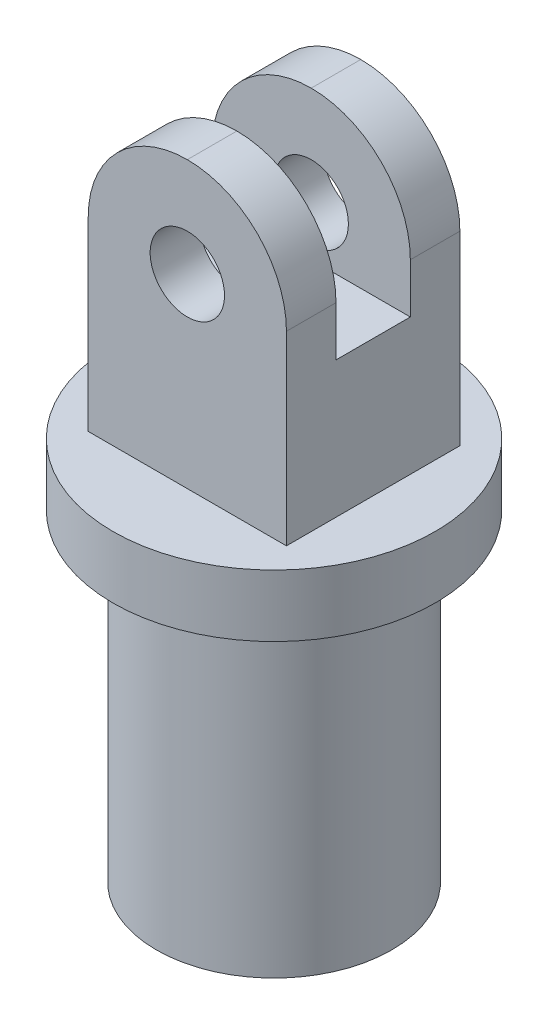
ISO-10303-21;
HEADER;
FILE_DESCRIPTION(('STEP AP214'),'2;1');
FILE_NAME('part.step','',(''),(''),'','','');
FILE_SCHEMA(('AUTOMOTIVE_DESIGN { 1 0 10303 214 1 1 1 1 }'));
ENDSEC;
DATA;
#1=APPLICATION_CONTEXT('core data for automotive mechanical design processes');
#2=APPLICATION_PROTOCOL_DEFINITION('international standard','automotive_design',2000,#1);
#3=PRODUCT_CONTEXT('',#1,'mechanical');
#4=PRODUCT('Part','Part','',(#3));
#5=PRODUCT_RELATED_PRODUCT_CATEGORY('part','',(#4));
#6=PRODUCT_DEFINITION_FORMATION('','',#4);
#7=PRODUCT_DEFINITION_CONTEXT('part definition',#1,'design');
#8=PRODUCT_DEFINITION('design','',#6,#7);
#9=PRODUCT_DEFINITION_SHAPE('','',#8);
#10=(LENGTH_UNIT() NAMED_UNIT(*) SI_UNIT(.MILLI.,.METRE.));
#11=(NAMED_UNIT(*) PLANE_ANGLE_UNIT() SI_UNIT($,.RADIAN.));
#12=(NAMED_UNIT(*) SI_UNIT($,.STERADIAN.) SOLID_ANGLE_UNIT());
#13=UNCERTAINTY_MEASURE_WITH_UNIT(LENGTH_MEASURE(1.E-05),#10,'distance_accuracy_value','');
#14=(GEOMETRIC_REPRESENTATION_CONTEXT(3) GLOBAL_UNCERTAINTY_ASSIGNED_CONTEXT((#13)) GLOBAL_UNIT_ASSIGNED_CONTEXT((#10,
#11,#12)) REPRESENTATION_CONTEXT('',''));
#15=CARTESIAN_POINT('',(0.,0.,0.));
#16=DIRECTION('',(0.,0.,1.));
#17=DIRECTION('',(1.,0.,0.));
#18=AXIS2_PLACEMENT_3D('',#15,#16,#17);
#19=CARTESIAN_POINT('',(0.,10.,3.5));
#20=DIRECTION('',(0.,0.,-1.));
#21=DIRECTION('',(-1.,0.,0.));
#22=AXIS2_PLACEMENT_3D('',#19,#20,#21);
#23=CYLINDRICAL_SURFACE('',#22,4.);
#24=CARTESIAN_POINT('',(0.,10.,1.5));
#25=DIRECTION('',(0.,0.,1.));
#26=DIRECTION('',(0.,-1.,0.));
#27=AXIS2_PLACEMENT_3D('',#24,#25,#26);
#28=CIRCLE('',#27,4.);
#29=CARTESIAN_POINT('',(-4.,10.,1.5));
#30=VERTEX_POINT('',#29);
#31=CARTESIAN_POINT('',(0.,14.,1.5));
#32=VERTEX_POINT('',#31);
#33=EDGE_CURVE('E142',#30,#32,#28,.F.);
#34=ORIENTED_EDGE('',*,*,#33,.F.);
#35=DIRECTION('',(0.,0.,1.));
#36=VECTOR('',#35,1.);
#37=CARTESIAN_POINT('',(-4.,10.,-3.5));
#38=LINE('',#37,#36);
#39=CARTESIAN_POINT('',(-4.,10.,3.5));
#40=VERTEX_POINT('',#39);
#41=EDGE_CURVE('E40',#40,#30,#38,.F.);
#42=ORIENTED_EDGE('',*,*,#41,.F.);
#43=CARTESIAN_POINT('',(0.,10.,3.5));
#44=DIRECTION('',(0.,0.,-1.));
#45=DIRECTION('',(-1.,0.,0.));
#46=AXIS2_PLACEMENT_3D('',#43,#44,#45);
#47=CIRCLE('',#46,4.);
#48=CARTESIAN_POINT('',(0.,14.,3.5));
#49=VERTEX_POINT('',#48);
#50=EDGE_CURVE('E55',#49,#40,#47,.F.);
#51=ORIENTED_EDGE('',*,*,#50,.F.);
#52=DIRECTION('',(0.,0.,1.));
#53=VECTOR('',#52,1.);
#54=CARTESIAN_POINT('',(0.,14.,3.5));
#55=LINE('',#54,#53);
#56=EDGE_CURVE('E205',#32,#49,#55,.T.);
#57=ORIENTED_EDGE('',*,*,#56,.F.);
#58=EDGE_LOOP('',(#34,#42,#51,#57));
#59=FACE_BOUND('',#58,.T.);
#60=ADVANCED_FACE('F32',(#59),#23,.T.);
#61=CARTESIAN_POINT('',(0.,10.,3.5));
#62=DIRECTION('',(0.,0.,1.));
#63=DIRECTION('',(1.,0.,0.));
#64=AXIS2_PLACEMENT_3D('',#61,#62,#63);
#65=CYLINDRICAL_SURFACE('',#64,4.);
#66=CARTESIAN_POINT('',(0.,10.,1.5));
#67=DIRECTION('',(0.,0.,1.));
#68=DIRECTION('',(0.,-1.,0.));
#69=AXIS2_PLACEMENT_3D('',#66,#67,#68);
#70=CIRCLE('',#69,4.);
#71=CARTESIAN_POINT('',(4.,10.,1.5));
#72=VERTEX_POINT('',#71);
#73=EDGE_CURVE('E140',#32,#72,#70,.F.);
#74=ORIENTED_EDGE('',*,*,#73,.F.);
#75=ORIENTED_EDGE('',*,*,#56,.T.);
#76=CARTESIAN_POINT('',(0.,10.,3.5));
#77=DIRECTION('',(0.,0.,-1.));
#78=DIRECTION('',(-1.,0.,0.));
#79=AXIS2_PLACEMENT_3D('',#76,#77,#78);
#80=CIRCLE('',#79,4.);
#81=CARTESIAN_POINT('',(4.,10.,3.5));
#82=VERTEX_POINT('',#81);
#83=EDGE_CURVE('E199',#82,#49,#80,.F.);
#84=ORIENTED_EDGE('',*,*,#83,.F.);
#85=DIRECTION('',(0.,0.,-1.));
#86=VECTOR('',#85,1.);
#87=CARTESIAN_POINT('',(4.,10.,3.5));
#88=LINE('',#87,#86);
#89=EDGE_CURVE('E194',#72,#82,#88,.F.);
#90=ORIENTED_EDGE('',*,*,#89,.F.);
#91=EDGE_LOOP('',(#74,#75,#84,#90));
#92=FACE_BOUND('',#91,.T.);
#93=ADVANCED_FACE('F245',(#92),#65,.T.);
#94=CARTESIAN_POINT('',(0.,10.,-9.5));
#95=DIRECTION('',(0.,0.,1.));
#96=DIRECTION('',(1.,0.,0.));
#97=AXIS2_PLACEMENT_3D('',#94,#95,#96);
#98=CYLINDRICAL_SURFACE('',#97,1.5);
#99=CARTESIAN_POINT('',(0.,10.,1.5));
#100=DIRECTION('',(0.,0.,1.));
#101=DIRECTION('',(0.,-1.,0.));
#102=AXIS2_PLACEMENT_3D('',#99,#100,#101);
#103=CIRCLE('',#102,1.5);
#104=CARTESIAN_POINT('',(1.5,10.,1.5));
#105=VERTEX_POINT('',#104);
#106=EDGE_CURVE('E139',#105,#105,#103,.F.);
#107=CARTESIAN_POINT('',(0.,10.,3.5));
#108=DIRECTION('',(0.,0.,1.));
#109=DIRECTION('',(1.,0.,0.));
#110=AXIS2_PLACEMENT_3D('',#107,#108,#109);
#111=CIRCLE('',#110,1.5);
#112=CARTESIAN_POINT('',(1.5,10.,3.5));
#113=VERTEX_POINT('',#112);
#114=EDGE_CURVE('E147',#113,#113,#111,.T.);
#115=CARTESIAN_POINT('',(1.5,10.,1.5));
#116=CARTESIAN_POINT('',(1.5,10.,1.52083333333333));
#117=CARTESIAN_POINT('',(1.5,10.,1.54166666666666));
#118=CARTESIAN_POINT('',(1.5,10.,1.58333333333333));
#119=CARTESIAN_POINT('',(1.5,10.,1.60416666666666));
#120=CARTESIAN_POINT('',(1.5,10.,1.64583333333333));
#121=CARTESIAN_POINT('',(1.5,10.,1.66666666666666));
#122=CARTESIAN_POINT('',(1.5,10.,1.70833333333333));
#123=CARTESIAN_POINT('',(1.5,10.,1.72916666666666));
#124=CARTESIAN_POINT('',(1.5,10.,1.77083333333333));
#125=CARTESIAN_POINT('',(1.5,10.,1.79166666666666));
#126=CARTESIAN_POINT('',(1.5,10.,1.83333333333333));
#127=CARTESIAN_POINT('',(1.5,10.,1.85416666666666));
#128=CARTESIAN_POINT('',(1.5,10.,1.89583333333333));
#129=CARTESIAN_POINT('',(1.5,10.,1.91666666666666));
#130=CARTESIAN_POINT('',(1.5,10.,1.95833333333333));
#131=CARTESIAN_POINT('',(1.5,10.,1.97916666666667));
#132=CARTESIAN_POINT('',(1.5,10.,2.02083333333333));
#133=CARTESIAN_POINT('',(1.5,10.,2.04166666666667));
#134=CARTESIAN_POINT('',(1.5,10.,2.08333333333333));
#135=CARTESIAN_POINT('',(1.5,10.,2.10416666666667));
#136=CARTESIAN_POINT('',(1.5,10.,2.14583333333333));
#137=CARTESIAN_POINT('',(1.5,10.,2.16666666666667));
#138=CARTESIAN_POINT('',(1.5,10.,2.20833333333333));
#139=CARTESIAN_POINT('',(1.5,10.,2.22916666666667));
#140=CARTESIAN_POINT('',(1.5,10.,2.27083333333333));
#141=CARTESIAN_POINT('',(1.5,10.,2.29166666666667));
#142=CARTESIAN_POINT('',(1.5,10.,2.33333333333333));
#143=CARTESIAN_POINT('',(1.5,10.,2.35416666666667));
#144=CARTESIAN_POINT('',(1.5,10.,2.39583333333333));
#145=CARTESIAN_POINT('',(1.5,10.,2.41666666666667));
#146=CARTESIAN_POINT('',(1.5,10.,2.45833333333333));
#147=CARTESIAN_POINT('',(1.5,10.,2.47916666666667));
#148=CARTESIAN_POINT('',(1.5,10.,2.52083333333333));
#149=CARTESIAN_POINT('',(1.5,10.,2.54166666666667));
#150=CARTESIAN_POINT('',(1.5,10.,2.58333333333333));
#151=CARTESIAN_POINT('',(1.5,10.,2.60416666666667));
#152=CARTESIAN_POINT('',(1.5,10.,2.64583333333333));
#153=CARTESIAN_POINT('',(1.5,10.,2.66666666666667));
#154=CARTESIAN_POINT('',(1.5,10.,2.70833333333333));
#155=CARTESIAN_POINT('',(1.5,10.,2.72916666666667));
#156=CARTESIAN_POINT('',(1.5,10.,2.77083333333333));
#157=CARTESIAN_POINT('',(1.5,10.,2.79166666666667));
#158=CARTESIAN_POINT('',(1.5,10.,2.83333333333333));
#159=CARTESIAN_POINT('',(1.5,10.,2.85416666666667));
#160=CARTESIAN_POINT('',(1.5,10.,2.89583333333333));
#161=CARTESIAN_POINT('',(1.5,10.,2.91666666666667));
#162=CARTESIAN_POINT('',(1.5,10.,2.95833333333333));
#163=CARTESIAN_POINT('',(1.5,10.,2.97916666666667));
#164=CARTESIAN_POINT('',(1.5,10.,3.02083333333333));
#165=CARTESIAN_POINT('',(1.5,10.,3.04166666666667));
#166=CARTESIAN_POINT('',(1.5,10.,3.08333333333333));
#167=CARTESIAN_POINT('',(1.5,10.,3.10416666666667));
#168=CARTESIAN_POINT('',(1.5,10.,3.14583333333333));
#169=CARTESIAN_POINT('',(1.5,10.,3.16666666666667));
#170=CARTESIAN_POINT('',(1.5,10.,3.20833333333333));
#171=CARTESIAN_POINT('',(1.5,10.,3.22916666666667));
#172=CARTESIAN_POINT('',(1.5,10.,3.27083333333333));
#173=CARTESIAN_POINT('',(1.5,10.,3.29166666666667));
#174=CARTESIAN_POINT('',(1.5,10.,3.33333333333333));
#175=CARTESIAN_POINT('',(1.5,10.,3.35416666666667));
#176=CARTESIAN_POINT('',(1.5,10.,3.39583333333333));
#177=CARTESIAN_POINT('',(1.5,10.,3.41666666666667));
#178=CARTESIAN_POINT('',(1.5,10.,3.45833333333333));
#179=CARTESIAN_POINT('',(1.5,10.,3.47916666666667));
#180=CARTESIAN_POINT('',(1.5,10.,3.5));
#181=B_SPLINE_CURVE_WITH_KNOTS('',3,(#115,#116,#117,#118,#119,#120,#121,#122,#123,#124,#125,
#126,#127,#128,#129,#130,#131,#132,#133,#134,#135,#136,#137,#138,#139,#140,#141,#142,#143,#144,
#145,#146,#147,#148,#149,#150,#151,#152,#153,#154,#155,#156,#157,#158,#159,#160,#161,#162,#163,
#164,#165,#166,#167,#168,#169,#170,#171,#172,#173,#174,#175,#176,#177,#178,#179,#180),
.UNSPECIFIED.,.F.,.F.,(4,2,2,2,2,2,2,2,2,2,2,2,2,2,2,2,2,2,2,2,2,2,2,2,2,2,2,2,2,2,2,2,4),(0.,
0.0625000000000001,0.125,0.1875,0.25,0.3125,0.375,0.4375,0.5,0.5625,0.625000000000001,
0.687500000000001,0.750000000000001,0.812500000000001,0.875000000000001,0.937500000000001,1.,
1.0625,1.125,1.1875,1.25,1.3125,1.375,1.4375,1.5,1.5625,1.625,1.6875,1.75,1.8125,1.875,1.9375,
2.),.UNSPECIFIED.);
#182=EDGE_CURVE('BSEAM212',#105,#113,#181,.T.);
#183=ORIENTED_EDGE('',*,*,#106,.T.);
#184=ORIENTED_EDGE('',*,*,#114,.T.);
#185=ORIENTED_EDGE('',*,*,#182,.T.);
#186=ORIENTED_EDGE('',*,*,#182,.F.);
#187=EDGE_LOOP('',(#183,#185,#184,#186));
#188=FACE_BOUND('',#187,.T.);
#189=ADVANCED_FACE('F212',(#188),#98,.F.);
#190=CARTESIAN_POINT('',(0.,2.5,0.));
#191=DIRECTION('',(0.,1.,0.));
#192=DIRECTION('',(0.,0.,1.));
#193=AXIS2_PLACEMENT_3D('',#190,#191,#192);
#194=PLANE('',#193);
#195=CARTESIAN_POINT('',(0.,2.5,0.));
#196=DIRECTION('',(0.,1.,0.));
#197=DIRECTION('',(0.,0.,1.));
#198=AXIS2_PLACEMENT_3D('',#195,#196,#197);
#199=CIRCLE('',#198,6.5);
#200=CARTESIAN_POINT('',(0.,2.5,6.5));
#201=VERTEX_POINT('',#200);
#202=EDGE_CURVE('E182',#201,#201,#199,.T.);
#203=ORIENTED_EDGE('',*,*,#202,.T.);
#204=EDGE_LOOP('',(#203));
#205=FACE_BOUND('',#204,.T.);
#206=DIRECTION('',(1.,0.,0.));
#207=VECTOR('',#206,1.);
#208=CARTESIAN_POINT('',(-4.,2.5,3.5));
#209=LINE('',#208,#207);
#210=CARTESIAN_POINT('',(-4.,2.5,3.5));
#211=VERTEX_POINT('',#210);
#212=CARTESIAN_POINT('',(4.,2.5,3.5));
#213=VERTEX_POINT('',#212);
#214=EDGE_CURVE('E154',#211,#213,#209,.T.);
#215=ORIENTED_EDGE('',*,*,#214,.F.);
#216=DIRECTION('',(0.,0.,1.));
#217=VECTOR('',#216,1.);
#218=CARTESIAN_POINT('',(-4.,2.5,-3.5));
#219=LINE('',#218,#217);
#220=CARTESIAN_POINT('',(-4.,2.5,-3.5));
#221=VERTEX_POINT('',#220);
#222=EDGE_CURVE('E151',#221,#211,#219,.T.);
#223=ORIENTED_EDGE('',*,*,#222,.F.);
#224=DIRECTION('',(-1.,0.,0.));
#225=VECTOR('',#224,1.);
#226=CARTESIAN_POINT('',(-4.,2.5,-3.5));
#227=LINE('',#226,#225);
#228=CARTESIAN_POINT('',(4.,2.5,-3.5));
#229=VERTEX_POINT('',#228);
#230=EDGE_CURVE('E161',#229,#221,#227,.T.);
#231=ORIENTED_EDGE('',*,*,#230,.F.);
#232=DIRECTION('',(0.,0.,-1.));
#233=VECTOR('',#232,1.);
#234=CARTESIAN_POINT('',(4.,2.5,-3.5));
#235=LINE('',#234,#233);
#236=EDGE_CURVE('E158',#213,#229,#235,.T.);
#237=ORIENTED_EDGE('',*,*,#236,.F.);
#238=EDGE_LOOP('',(#215,#223,#231,#237));
#239=FACE_BOUND('',#238,.T.);
#240=ADVANCED_FACE('F239',(#205,#239),#194,.T.);
#241=CARTESIAN_POINT('',(0.,0.,0.));
#242=DIRECTION('',(0.,1.,0.));
#243=DIRECTION('',(0.,0.,1.));
#244=AXIS2_PLACEMENT_3D('',#241,#242,#243);
#245=PLANE('',#244);
#246=CARTESIAN_POINT('',(0.,0.,0.));
#247=DIRECTION('',(0.,1.,0.));
#248=DIRECTION('',(0.,0.,1.));
#249=AXIS2_PLACEMENT_3D('',#246,#247,#248);
#250=CIRCLE('',#249,6.5);
#251=CARTESIAN_POINT('',(0.,0.,6.5));
#252=VERTEX_POINT('',#251);
#253=EDGE_CURVE('E181',#252,#252,#250,.T.);
#254=ORIENTED_EDGE('',*,*,#253,.F.);
#255=EDGE_LOOP('',(#254));
#256=FACE_BOUND('',#255,.T.);
#257=CARTESIAN_POINT('',(0.,0.,0.));
#258=DIRECTION('',(0.,1.,0.));
#259=DIRECTION('',(0.,0.,1.));
#260=AXIS2_PLACEMENT_3D('',#257,#258,#259);
#261=CIRCLE('',#260,4.75);
#262=CARTESIAN_POINT('',(0.,0.,4.75));
#263=VERTEX_POINT('',#262);
#264=EDGE_CURVE('E185',#263,#263,#261,.F.);
#265=ORIENTED_EDGE('',*,*,#264,.F.);
#266=EDGE_LOOP('',(#265));
#267=FACE_BOUND('',#266,.T.);
#268=ADVANCED_FACE('F354',(#256,#267),#245,.F.);
#269=CARTESIAN_POINT('',(0.,2.5,0.));
#270=DIRECTION('',(0.,-1.,0.));
#271=DIRECTION('',(0.,0.,-1.));
#272=AXIS2_PLACEMENT_3D('',#269,#270,#271);
#273=CYLINDRICAL_SURFACE('',#272,6.5);
#274=ORIENTED_EDGE('',*,*,#202,.F.);
#275=EDGE_LOOP('',(#274));
#276=FACE_BOUND('',#275,.T.);
#277=ORIENTED_EDGE('',*,*,#253,.T.);
#278=EDGE_LOOP('',(#277));
#279=FACE_BOUND('',#278,.T.);
#280=ADVANCED_FACE('F383',(#276,#279),#273,.T.);
#281=CARTESIAN_POINT('',(0.,-13.,0.));
#282=DIRECTION('',(0.,-1.,0.));
#283=DIRECTION('',(0.,0.,-1.));
#284=AXIS2_PLACEMENT_3D('',#281,#282,#283);
#285=PLANE('',#284);
#286=CARTESIAN_POINT('',(0.,-13.,0.));
#287=DIRECTION('',(0.,-1.,0.));
#288=DIRECTION('',(0.,0.,-1.));
#289=AXIS2_PLACEMENT_3D('',#286,#287,#288);
#290=CIRCLE('',#289,4.75);
#291=CARTESIAN_POINT('',(0.,-13.,4.75));
#292=VERTEX_POINT('',#291);
#293=EDGE_CURVE('E176',#292,#292,#290,.T.);
#294=ORIENTED_EDGE('',*,*,#293,.T.);
#295=EDGE_LOOP('',(#294));
#296=FACE_BOUND('',#295,.T.);
#297=CARTESIAN_POINT('',(0.,-13.,0.));
#298=DIRECTION('',(0.,-1.,0.));
#299=DIRECTION('',(0.,0.,-1.));
#300=AXIS2_PLACEMENT_3D('',#297,#298,#299);
#301=CIRCLE('',#300,3.);
#302=CARTESIAN_POINT('',(0.,-13.,3.));
#303=VERTEX_POINT('',#302);
#304=EDGE_CURVE('E173',#303,#303,#301,.T.);
#305=ORIENTED_EDGE('',*,*,#304,.F.);
#306=EDGE_LOOP('',(#305));
#307=FACE_BOUND('',#306,.T.);
#308=ADVANCED_FACE('F374',(#296,#307),#285,.T.);
#309=CARTESIAN_POINT('',(0.,-13.,0.));
#310=DIRECTION('',(0.,1.,0.));
#311=DIRECTION('',(0.,0.,1.));
#312=AXIS2_PLACEMENT_3D('',#309,#310,#311);
#313=CYLINDRICAL_SURFACE('',#312,4.75);
#314=CARTESIAN_POINT('',(0.,-13.,4.75));
#315=CARTESIAN_POINT('',(0.,-12.8645833333333,4.75));
#316=CARTESIAN_POINT('',(0.,-12.7291666666667,4.75));
#317=CARTESIAN_POINT('',(0.,-12.4583333333333,4.75));
#318=CARTESIAN_POINT('',(0.,-12.3229166666667,4.75));
#319=CARTESIAN_POINT('',(0.,-12.0520833333333,4.75));
#320=CARTESIAN_POINT('',(0.,-11.9166666666667,4.75));
#321=CARTESIAN_POINT('',(0.,-11.6458333333333,4.75));
#322=CARTESIAN_POINT('',(0.,-11.5104166666667,4.75));
#323=CARTESIAN_POINT('',(0.,-11.2395833333333,4.75));
#324=CARTESIAN_POINT('',(0.,-11.1041666666667,4.75));
#325=CARTESIAN_POINT('',(0.,-10.8333333333333,4.75));
#326=CARTESIAN_POINT('',(0.,-10.6979166666667,4.75));
#327=CARTESIAN_POINT('',(0.,-10.4270833333333,4.75));
#328=CARTESIAN_POINT('',(0.,-10.2916666666667,4.75));
#329=CARTESIAN_POINT('',(0.,-10.0208333333333,4.75));
#330=CARTESIAN_POINT('',(0.,-9.88541666666667,4.75));
#331=CARTESIAN_POINT('',(0.,-9.61458333333333,4.75));
#332=CARTESIAN_POINT('',(0.,-9.47916666666667,4.75));
#333=CARTESIAN_POINT('',(0.,-9.20833333333333,4.75));
#334=CARTESIAN_POINT('',(0.,-9.07291666666666,4.75));
#335=CARTESIAN_POINT('',(0.,-8.80208333333333,4.75));
#336=CARTESIAN_POINT('',(0.,-8.66666666666667,4.75));
#337=CARTESIAN_POINT('',(0.,-8.39583333333333,4.75));
#338=CARTESIAN_POINT('',(0.,-8.26041666666667,4.75));
#339=CARTESIAN_POINT('',(0.,-7.98958333333333,4.75));
#340=CARTESIAN_POINT('',(0.,-7.85416666666667,4.75));
#341=CARTESIAN_POINT('',(0.,-7.58333333333333,4.75));
#342=CARTESIAN_POINT('',(0.,-7.44791666666667,4.75));
#343=CARTESIAN_POINT('',(0.,-7.17708333333333,4.75));
#344=CARTESIAN_POINT('',(0.,-7.04166666666667,4.75));
#345=CARTESIAN_POINT('',(0.,-6.77083333333333,4.75));
#346=CARTESIAN_POINT('',(0.,-6.63541666666667,4.75));
#347=CARTESIAN_POINT('',(0.,-6.36458333333333,4.75));
#348=CARTESIAN_POINT('',(0.,-6.22916666666667,4.75));
#349=CARTESIAN_POINT('',(0.,-5.95833333333333,4.75));
#350=CARTESIAN_POINT('',(0.,-5.82291666666667,4.75));
#351=CARTESIAN_POINT('',(0.,-5.55208333333333,4.75));
#352=CARTESIAN_POINT('',(0.,-5.41666666666667,4.75));
#353=CARTESIAN_POINT('',(0.,-5.14583333333333,4.75));
#354=CARTESIAN_POINT('',(0.,-5.01041666666667,4.75));
#355=CARTESIAN_POINT('',(0.,-4.73958333333333,4.75));
#356=CARTESIAN_POINT('',(0.,-4.60416666666667,4.75));
#357=CARTESIAN_POINT('',(0.,-4.33333333333333,4.75));
#358=CARTESIAN_POINT('',(0.,-4.19791666666667,4.75));
#359=CARTESIAN_POINT('',(0.,-3.92708333333333,4.75));
#360=CARTESIAN_POINT('',(0.,-3.79166666666667,4.75));
#361=CARTESIAN_POINT('',(0.,-3.52083333333333,4.75));
#362=CARTESIAN_POINT('',(0.,-3.38541666666667,4.75));
#363=CARTESIAN_POINT('',(0.,-3.11458333333333,4.75));
#364=CARTESIAN_POINT('',(0.,-2.97916666666667,4.75));
#365=CARTESIAN_POINT('',(0.,-2.70833333333333,4.75));
#366=CARTESIAN_POINT('',(0.,-2.57291666666667,4.75));
#367=CARTESIAN_POINT('',(0.,-2.30208333333333,4.75));
#368=CARTESIAN_POINT('',(0.,-2.16666666666667,4.75));
#369=CARTESIAN_POINT('',(0.,-1.89583333333333,4.75));
#370=CARTESIAN_POINT('',(0.,-1.76041666666667,4.75));
#371=CARTESIAN_POINT('',(0.,-1.48958333333333,4.75));
#372=CARTESIAN_POINT('',(0.,-1.35416666666667,4.75));
#373=CARTESIAN_POINT('',(0.,-1.08333333333333,4.75));
#374=CARTESIAN_POINT('',(0.,-0.947916666666667,4.75));
#375=CARTESIAN_POINT('',(0.,-0.677083333333334,4.75));
#376=CARTESIAN_POINT('',(0.,-0.541666666666667,4.75));
#377=CARTESIAN_POINT('',(0.,-0.270833333333334,4.75));
#378=CARTESIAN_POINT('',(0.,-0.135416666666667,4.75));
#379=CARTESIAN_POINT('',(0.,0.,4.75));
#380=B_SPLINE_CURVE_WITH_KNOTS('',3,(#314,#315,#316,#317,#318,#319,#320,#321,#322,#323,#324,
#325,#326,#327,#328,#329,#330,#331,#332,#333,#334,#335,#336,#337,#338,#339,#340,#341,#342,#343,
#344,#345,#346,#347,#348,#349,#350,#351,#352,#353,#354,#355,#356,#357,#358,#359,#360,#361,#362,
#363,#364,#365,#366,#367,#368,#369,#370,#371,#372,#373,#374,#375,#376,#377,#378,#379),
.UNSPECIFIED.,.F.,.F.,(4,2,2,2,2,2,2,2,2,2,2,2,2,2,2,2,2,2,2,2,2,2,2,2,2,2,2,2,2,2,2,2,4),(0.,
0.40625,0.812500000000001,1.21875,1.625,2.03125,2.4375,2.84375,3.25,3.65625,4.0625,4.46875,
4.875,5.28125,5.6875,6.09375,6.5,6.90625,7.3125,7.71875,8.125,8.53125,8.9375,9.34375,9.75,
10.15625,10.5625,10.96875,11.375,11.78125,12.1875,12.59375,13.),.UNSPECIFIED.);
#381=EDGE_CURVE('BSEAM365',#292,#263,#380,.T.);
#382=ORIENTED_EDGE('',*,*,#293,.F.);
#383=ORIENTED_EDGE('',*,*,#264,.T.);
#384=ORIENTED_EDGE('',*,*,#381,.T.);
#385=ORIENTED_EDGE('',*,*,#381,.F.);
#386=EDGE_LOOP('',(#382,#384,#383,#385));
#387=FACE_BOUND('',#386,.T.);
#388=ADVANCED_FACE('F365',(#387),#313,.T.);
#389=CARTESIAN_POINT('',(0.,-13.,0.));
#390=DIRECTION('',(0.,1.,0.));
#391=DIRECTION('',(0.,0.,1.));
#392=AXIS2_PLACEMENT_3D('',#389,#390,#391);
#393=CYLINDRICAL_SURFACE('',#392,3.);
#394=CARTESIAN_POINT('',(0.,0.,0.));
#395=DIRECTION('',(0.,-1.,0.));
#396=DIRECTION('',(0.,0.,-1.));
#397=AXIS2_PLACEMENT_3D('',#394,#395,#396);
#398=CIRCLE('',#397,3.);
#399=CARTESIAN_POINT('',(0.,0.,3.));
#400=VERTEX_POINT('',#399);
#401=EDGE_CURVE('E172',#400,#400,#398,.T.);
#402=CARTESIAN_POINT('',(0.,-13.,3.));
#403=CARTESIAN_POINT('',(0.,-12.8645833333333,3.));
#404=CARTESIAN_POINT('',(0.,-12.7291666666667,3.));
#405=CARTESIAN_POINT('',(0.,-12.4583333333333,3.));
#406=CARTESIAN_POINT('',(0.,-12.3229166666667,3.));
#407=CARTESIAN_POINT('',(0.,-12.0520833333333,3.));
#408=CARTESIAN_POINT('',(0.,-11.9166666666667,3.));
#409=CARTESIAN_POINT('',(0.,-11.6458333333333,3.));
#410=CARTESIAN_POINT('',(0.,-11.5104166666667,3.));
#411=CARTESIAN_POINT('',(0.,-11.2395833333333,3.));
#412=CARTESIAN_POINT('',(0.,-11.1041666666667,3.));
#413=CARTESIAN_POINT('',(0.,-10.8333333333333,3.));
#414=CARTESIAN_POINT('',(0.,-10.6979166666667,3.));
#415=CARTESIAN_POINT('',(0.,-10.4270833333333,3.));
#416=CARTESIAN_POINT('',(0.,-10.2916666666667,3.));
#417=CARTESIAN_POINT('',(0.,-10.0208333333333,3.));
#418=CARTESIAN_POINT('',(0.,-9.88541666666667,3.));
#419=CARTESIAN_POINT('',(0.,-9.61458333333333,3.));
#420=CARTESIAN_POINT('',(0.,-9.47916666666667,3.));
#421=CARTESIAN_POINT('',(0.,-9.20833333333333,3.));
#422=CARTESIAN_POINT('',(0.,-9.07291666666667,3.));
#423=CARTESIAN_POINT('',(0.,-8.80208333333333,3.));
#424=CARTESIAN_POINT('',(0.,-8.66666666666667,3.));
#425=CARTESIAN_POINT('',(0.,-8.39583333333333,3.));
#426=CARTESIAN_POINT('',(0.,-8.26041666666667,3.));
#427=CARTESIAN_POINT('',(0.,-7.98958333333333,3.));
#428=CARTESIAN_POINT('',(0.,-7.85416666666667,3.));
#429=CARTESIAN_POINT('',(0.,-7.58333333333333,3.));
#430=CARTESIAN_POINT('',(0.,-7.44791666666667,3.));
#431=CARTESIAN_POINT('',(0.,-7.17708333333333,3.));
#432=CARTESIAN_POINT('',(0.,-7.04166666666667,3.));
#433=CARTESIAN_POINT('',(0.,-6.77083333333333,3.));
#434=CARTESIAN_POINT('',(0.,-6.63541666666667,3.));
#435=CARTESIAN_POINT('',(0.,-6.36458333333333,3.));
#436=CARTESIAN_POINT('',(0.,-6.22916666666667,3.));
#437=CARTESIAN_POINT('',(0.,-5.95833333333333,3.));
#438=CARTESIAN_POINT('',(0.,-5.82291666666667,3.));
#439=CARTESIAN_POINT('',(0.,-5.55208333333333,3.));
#440=CARTESIAN_POINT('',(0.,-5.41666666666667,3.));
#441=CARTESIAN_POINT('',(0.,-5.14583333333333,3.));
#442=CARTESIAN_POINT('',(0.,-5.01041666666667,3.));
#443=CARTESIAN_POINT('',(0.,-4.73958333333333,3.));
#444=CARTESIAN_POINT('',(0.,-4.60416666666667,3.));
#445=CARTESIAN_POINT('',(0.,-4.33333333333333,3.));
#446=CARTESIAN_POINT('',(0.,-4.19791666666667,3.));
#447=CARTESIAN_POINT('',(0.,-3.92708333333333,3.));
#448=CARTESIAN_POINT('',(0.,-3.79166666666667,3.));
#449=CARTESIAN_POINT('',(0.,-3.52083333333333,3.));
#450=CARTESIAN_POINT('',(0.,-3.38541666666667,3.));
#451=CARTESIAN_POINT('',(0.,-3.11458333333333,3.));
#452=CARTESIAN_POINT('',(0.,-2.97916666666667,3.));
#453=CARTESIAN_POINT('',(0.,-2.70833333333333,3.));
#454=CARTESIAN_POINT('',(0.,-2.57291666666667,3.));
#455=CARTESIAN_POINT('',(0.,-2.30208333333333,3.));
#456=CARTESIAN_POINT('',(0.,-2.16666666666667,3.));
#457=CARTESIAN_POINT('',(0.,-1.89583333333333,3.));
#458=CARTESIAN_POINT('',(0.,-1.76041666666667,3.));
#459=CARTESIAN_POINT('',(0.,-1.48958333333333,3.));
#460=CARTESIAN_POINT('',(0.,-1.35416666666667,3.));
#461=CARTESIAN_POINT('',(0.,-1.08333333333333,3.));
#462=CARTESIAN_POINT('',(0.,-0.947916666666667,3.));
#463=CARTESIAN_POINT('',(0.,-0.677083333333334,3.));
#464=CARTESIAN_POINT('',(0.,-0.541666666666667,3.));
#465=CARTESIAN_POINT('',(0.,-0.270833333333334,3.));
#466=CARTESIAN_POINT('',(0.,-0.135416666666667,3.));
#467=CARTESIAN_POINT('',(0.,0.,3.));
#468=B_SPLINE_CURVE_WITH_KNOTS('',3,(#402,#403,#404,#405,#406,#407,#408,#409,#410,#411,#412,
#413,#414,#415,#416,#417,#418,#419,#420,#421,#422,#423,#424,#425,#426,#427,#428,#429,#430,#431,
#432,#433,#434,#435,#436,#437,#438,#439,#440,#441,#442,#443,#444,#445,#446,#447,#448,#449,#450,
#451,#452,#453,#454,#455,#456,#457,#458,#459,#460,#461,#462,#463,#464,#465,#466,#467),
.UNSPECIFIED.,.F.,.F.,(4,2,2,2,2,2,2,2,2,2,2,2,2,2,2,2,2,2,2,2,2,2,2,2,2,2,2,2,2,2,2,2,4),(0.,
0.406249999999999,0.812499999999999,1.21875,1.625,2.03125,2.4375,2.84375,3.25,3.65625,4.0625,
4.46875,4.875,5.28125,5.6875,6.09375,6.5,6.90625,7.3125,7.71875,8.125,8.53125,8.9375,9.34375,
9.75,10.15625,10.5625,10.96875,11.375,11.78125,12.1875,12.59375,13.),.UNSPECIFIED.);
#469=EDGE_CURVE('BSEAM359',#303,#400,#468,.T.);
#470=ORIENTED_EDGE('',*,*,#304,.T.);
#471=ORIENTED_EDGE('',*,*,#401,.F.);
#472=ORIENTED_EDGE('',*,*,#469,.T.);
#473=ORIENTED_EDGE('',*,*,#469,.F.);
#474=EDGE_LOOP('',(#470,#472,#471,#473));
#475=FACE_BOUND('',#474,.T.);
#476=ADVANCED_FACE('F359',(#475),#393,.F.);
#477=ORIENTED_EDGE('',*,*,#401,.T.);
#478=EDGE_LOOP('',(#477));
#479=FACE_BOUND('',#478,.T.);
#480=ADVANCED_FACE('F257',(#479),#245,.F.);
#481=CARTESIAN_POINT('',(-4.,14.,-3.5));
#482=DIRECTION('',(1.,0.,0.));
#483=DIRECTION('',(0.,0.,-1.));
#484=AXIS2_PLACEMENT_3D('',#481,#482,#483);
#485=PLANE('',#484);
#486=ORIENTED_EDGE('',*,*,#41,.T.);
#487=DIRECTION('',(0.,1.,0.));
#488=VECTOR('',#487,1.);
#489=CARTESIAN_POINT('',(-4.,18.2070291092803,1.5));
#490=LINE('',#489,#488);
#491=CARTESIAN_POINT('',(-4.,8.,1.5));
#492=VERTEX_POINT('',#491);
#493=EDGE_CURVE('E126',#492,#30,#490,.T.);
#494=ORIENTED_EDGE('',*,*,#493,.F.);
#495=DIRECTION('',(0.,0.,1.));
#496=VECTOR('',#495,1.);
#497=CARTESIAN_POINT('',(-4.,8.,1.5));
#498=LINE('',#497,#496);
#499=CARTESIAN_POINT('',(-4.,8.,-1.5));
#500=VERTEX_POINT('',#499);
#501=EDGE_CURVE('E115',#500,#492,#498,.T.);
#502=ORIENTED_EDGE('',*,*,#501,.F.);
#503=DIRECTION('',(0.,-1.,0.));
#504=VECTOR('',#503,1.);
#505=CARTESIAN_POINT('',(-4.,18.2070291092803,-1.5));
#506=LINE('',#505,#504);
#507=CARTESIAN_POINT('',(-4.,10.,-1.5));
#508=VERTEX_POINT('',#507);
#509=EDGE_CURVE('E120',#508,#500,#506,.T.);
#510=ORIENTED_EDGE('',*,*,#509,.F.);
#511=CARTESIAN_POINT('',(-4.,10.,-3.5));
#512=VERTEX_POINT('',#511);
#513=EDGE_CURVE('E201',#508,#512,#38,.F.);
#514=ORIENTED_EDGE('',*,*,#513,.T.);
#515=DIRECTION('',(0.,-1.,0.));
#516=VECTOR('',#515,1.);
#517=CARTESIAN_POINT('',(-4.,14.,-3.5));
#518=LINE('',#517,#516);
#519=EDGE_CURVE('E164',#512,#221,#518,.T.);
#520=ORIENTED_EDGE('',*,*,#519,.T.);
#521=ORIENTED_EDGE('',*,*,#222,.T.);
#522=DIRECTION('',(0.,-1.,0.));
#523=VECTOR('',#522,1.);
#524=CARTESIAN_POINT('',(-4.,14.,3.5));
#525=LINE('',#524,#523);
#526=EDGE_CURVE('E170',#40,#211,#525,.T.);
#527=ORIENTED_EDGE('',*,*,#526,.F.);
#528=EDGE_LOOP('',(#486,#494,#502,#510,#514,#520,#521,#527));
#529=FACE_BOUND('',#528,.T.);
#530=ADVANCED_FACE('F129',(#529),#485,.F.);
#531=CARTESIAN_POINT('',(-4.,14.,3.5));
#532=DIRECTION('',(0.,0.,-1.));
#533=DIRECTION('',(-1.,0.,0.));
#534=AXIS2_PLACEMENT_3D('',#531,#532,#533);
#535=PLANE('',#534);
#536=ORIENTED_EDGE('',*,*,#114,.F.);
#537=EDGE_LOOP('',(#536));
#538=FACE_BOUND('',#537,.T.);
#539=DIRECTION('',(0.,-1.,0.));
#540=VECTOR('',#539,1.);
#541=CARTESIAN_POINT('',(4.,14.,3.5));
#542=LINE('',#541,#540);
#543=EDGE_CURVE('E168',#82,#213,#542,.T.);
#544=ORIENTED_EDGE('',*,*,#543,.F.);
#545=ORIENTED_EDGE('',*,*,#83,.T.);
#546=ORIENTED_EDGE('',*,*,#50,.T.);
#547=ORIENTED_EDGE('',*,*,#526,.T.);
#548=ORIENTED_EDGE('',*,*,#214,.T.);
#549=EDGE_LOOP('',(#544,#545,#546,#547,#548));
#550=FACE_BOUND('',#549,.T.);
#551=ADVANCED_FACE('F248',(#538,#550),#535,.F.);
#552=CARTESIAN_POINT('',(4.,14.,-3.5));
#553=DIRECTION('',(-1.,0.,0.));
#554=DIRECTION('',(0.,0.,1.));
#555=AXIS2_PLACEMENT_3D('',#552,#553,#554);
#556=PLANE('',#555);
#557=DIRECTION('',(0.,0.,1.));
#558=VECTOR('',#557,1.);
#559=CARTESIAN_POINT('',(4.,8.,-3.5));
#560=LINE('',#559,#558);
#561=CARTESIAN_POINT('',(4.,8.,-1.5));
#562=VERTEX_POINT('',#561);
#563=CARTESIAN_POINT('',(4.,8.,1.5));
#564=VERTEX_POINT('',#563);
#565=EDGE_CURVE('E11',#562,#564,#560,.T.);
#566=ORIENTED_EDGE('',*,*,#565,.T.);
#567=DIRECTION('',(0.,1.,0.));
#568=VECTOR('',#567,1.);
#569=CARTESIAN_POINT('',(4.,14.,1.5));
#570=LINE('',#569,#568);
#571=EDGE_CURVE('E144',#564,#72,#570,.T.);
#572=ORIENTED_EDGE('',*,*,#571,.T.);
#573=ORIENTED_EDGE('',*,*,#89,.T.);
#574=ORIENTED_EDGE('',*,*,#543,.T.);
#575=ORIENTED_EDGE('',*,*,#236,.T.);
#576=DIRECTION('',(0.,-1.,0.));
#577=VECTOR('',#576,1.);
#578=CARTESIAN_POINT('',(4.,14.,-3.5));
#579=LINE('',#578,#577);
#580=CARTESIAN_POINT('',(4.,10.,-3.5));
#581=VERTEX_POINT('',#580);
#582=EDGE_CURVE('E166',#581,#229,#579,.T.);
#583=ORIENTED_EDGE('',*,*,#582,.F.);
#584=CARTESIAN_POINT('',(4.,10.,-1.5));
#585=VERTEX_POINT('',#584);
#586=EDGE_CURVE('E195',#581,#585,#88,.F.);
#587=ORIENTED_EDGE('',*,*,#586,.T.);
#588=DIRECTION('',(0.,-1.,0.));
#589=VECTOR('',#588,1.);
#590=CARTESIAN_POINT('',(4.,14.,-1.5));
#591=LINE('',#590,#589);
#592=EDGE_CURVE('E47',#585,#562,#591,.T.);
#593=ORIENTED_EDGE('',*,*,#592,.T.);
#594=EDGE_LOOP('',(#566,#572,#573,#574,#575,#583,#587,#593));
#595=FACE_BOUND('',#594,.T.);
#596=ADVANCED_FACE('F221',(#595),#556,.F.);
#597=CARTESIAN_POINT('',(-4.,14.,-3.5));
#598=DIRECTION('',(0.,0.,1.));
#599=DIRECTION('',(1.,0.,0.));
#600=AXIS2_PLACEMENT_3D('',#597,#598,#599);
#601=PLANE('',#600);
#602=CARTESIAN_POINT('',(0.,10.,-3.5));
#603=DIRECTION('',(0.,0.,1.));
#604=DIRECTION('',(1.,0.,0.));
#605=AXIS2_PLACEMENT_3D('',#602,#603,#604);
#606=CIRCLE('',#605,1.5);
#607=CARTESIAN_POINT('',(1.5,10.,-3.5));
#608=VERTEX_POINT('',#607);
#609=EDGE_CURVE('E150',#608,#608,#606,.T.);
#610=ORIENTED_EDGE('',*,*,#609,.T.);
#611=EDGE_LOOP('',(#610));
#612=FACE_BOUND('',#611,.T.);
#613=CARTESIAN_POINT('',(0.,10.,-3.5));
#614=DIRECTION('',(0.,0.,1.));
#615=DIRECTION('',(1.,0.,0.));
#616=AXIS2_PLACEMENT_3D('',#613,#614,#615);
#617=CIRCLE('',#616,4.);
#618=CARTESIAN_POINT('',(0.,14.,-3.5));
#619=VERTEX_POINT('',#618);
#620=EDGE_CURVE('E190',#512,#619,#617,.F.);
#621=ORIENTED_EDGE('',*,*,#620,.T.);
#622=CARTESIAN_POINT('',(0.,10.,-3.5));
#623=DIRECTION('',(0.,0.,1.));
#624=DIRECTION('',(1.,0.,0.));
#625=AXIS2_PLACEMENT_3D('',#622,#623,#624);
#626=CIRCLE('',#625,4.);
#627=EDGE_CURVE('E192',#619,#581,#626,.F.);
#628=ORIENTED_EDGE('',*,*,#627,.T.);
#629=ORIENTED_EDGE('',*,*,#582,.T.);
#630=ORIENTED_EDGE('',*,*,#230,.T.);
#631=ORIENTED_EDGE('',*,*,#519,.F.);
#632=EDGE_LOOP('',(#621,#628,#629,#630,#631));
#633=FACE_BOUND('',#632,.T.);
#634=ADVANCED_FACE('F233',(#612,#633),#601,.F.);
#635=CARTESIAN_POINT('',(0.,10.,-1.5));
#636=DIRECTION('',(0.,0.,-1.));
#637=DIRECTION('',(0.,1.,0.));
#638=AXIS2_PLACEMENT_3D('',#635,#636,#637);
#639=CIRCLE('',#638,4.);
#640=CARTESIAN_POINT('',(0.,14.,-1.5));
#641=VERTEX_POINT('',#640);
#642=EDGE_CURVE('E123',#641,#508,#639,.F.);
#643=ORIENTED_EDGE('',*,*,#642,.F.);
#644=EDGE_CURVE('E155',#619,#641,#55,.T.);
#645=ORIENTED_EDGE('',*,*,#644,.F.);
#646=ORIENTED_EDGE('',*,*,#620,.F.);
#647=ORIENTED_EDGE('',*,*,#513,.F.);
#648=EDGE_LOOP('',(#643,#645,#646,#647));
#649=FACE_BOUND('',#648,.T.);
#650=ADVANCED_FACE('F34',(#649),#23,.T.);
#651=CARTESIAN_POINT('',(0.,10.,-1.5));
#652=DIRECTION('',(0.,0.,-1.));
#653=DIRECTION('',(0.,1.,0.));
#654=AXIS2_PLACEMENT_3D('',#651,#652,#653);
#655=CIRCLE('',#654,4.);
#656=EDGE_CURVE('E135',#585,#641,#655,.F.);
#657=ORIENTED_EDGE('',*,*,#656,.F.);
#658=ORIENTED_EDGE('',*,*,#586,.F.);
#659=ORIENTED_EDGE('',*,*,#627,.F.);
#660=ORIENTED_EDGE('',*,*,#644,.T.);
#661=EDGE_LOOP('',(#657,#658,#659,#660));
#662=FACE_BOUND('',#661,.T.);
#663=ADVANCED_FACE('F227',(#662),#65,.T.);
#664=CARTESIAN_POINT('',(0.,10.,-1.5));
#665=DIRECTION('',(0.,0.,-1.));
#666=DIRECTION('',(0.,1.,0.));
#667=AXIS2_PLACEMENT_3D('',#664,#665,#666);
#668=CIRCLE('',#667,1.5);
#669=CARTESIAN_POINT('',(1.5,10.,-1.5));
#670=VERTEX_POINT('',#669);
#671=EDGE_CURVE('E133',#670,#670,#668,.F.);
#672=CARTESIAN_POINT('',(1.5,10.,-1.5));
#673=CARTESIAN_POINT('',(1.5,10.,-1.52083333333333));
#674=CARTESIAN_POINT('',(1.5,10.,-1.54166666666667));
#675=CARTESIAN_POINT('',(1.5,10.,-1.58333333333333));
#676=CARTESIAN_POINT('',(1.5,10.,-1.60416666666667));
#677=CARTESIAN_POINT('',(1.5,10.,-1.64583333333333));
#678=CARTESIAN_POINT('',(1.5,10.,-1.66666666666667));
#679=CARTESIAN_POINT('',(1.5,10.,-1.70833333333333));
#680=CARTESIAN_POINT('',(1.5,10.,-1.72916666666667));
#681=CARTESIAN_POINT('',(1.5,10.,-1.77083333333333));
#682=CARTESIAN_POINT('',(1.5,10.,-1.79166666666667));
#683=CARTESIAN_POINT('',(1.5,10.,-1.83333333333333));
#684=CARTESIAN_POINT('',(1.5,10.,-1.85416666666667));
#685=CARTESIAN_POINT('',(1.5,10.,-1.89583333333333));
#686=CARTESIAN_POINT('',(1.5,10.,-1.91666666666667));
#687=CARTESIAN_POINT('',(1.5,10.,-1.95833333333333));
#688=CARTESIAN_POINT('',(1.5,10.,-1.97916666666667));
#689=CARTESIAN_POINT('',(1.5,10.,-2.02083333333333));
#690=CARTESIAN_POINT('',(1.5,10.,-2.04166666666667));
#691=CARTESIAN_POINT('',(1.5,10.,-2.08333333333333));
#692=CARTESIAN_POINT('',(1.5,10.,-2.10416666666667));
#693=CARTESIAN_POINT('',(1.5,10.,-2.14583333333333));
#694=CARTESIAN_POINT('',(1.5,10.,-2.16666666666667));
#695=CARTESIAN_POINT('',(1.5,10.,-2.20833333333333));
#696=CARTESIAN_POINT('',(1.5,10.,-2.22916666666667));
#697=CARTESIAN_POINT('',(1.5,10.,-2.27083333333333));
#698=CARTESIAN_POINT('',(1.5,10.,-2.29166666666667));
#699=CARTESIAN_POINT('',(1.5,10.,-2.33333333333333));
#700=CARTESIAN_POINT('',(1.5,10.,-2.35416666666667));
#701=CARTESIAN_POINT('',(1.5,10.,-2.39583333333333));
#702=CARTESIAN_POINT('',(1.5,10.,-2.41666666666667));
#703=CARTESIAN_POINT('',(1.5,10.,-2.45833333333333));
#704=CARTESIAN_POINT('',(1.5,10.,-2.47916666666667));
#705=CARTESIAN_POINT('',(1.5,10.,-2.52083333333333));
#706=CARTESIAN_POINT('',(1.5,10.,-2.54166666666667));
#707=CARTESIAN_POINT('',(1.5,10.,-2.58333333333333));
#708=CARTESIAN_POINT('',(1.5,10.,-2.60416666666667));
#709=CARTESIAN_POINT('',(1.5,10.,-2.64583333333333));
#710=CARTESIAN_POINT('',(1.5,10.,-2.66666666666667));
#711=CARTESIAN_POINT('',(1.5,10.,-2.70833333333333));
#712=CARTESIAN_POINT('',(1.5,10.,-2.72916666666667));
#713=CARTESIAN_POINT('',(1.5,10.,-2.77083333333333));
#714=CARTESIAN_POINT('',(1.5,10.,-2.79166666666667));
#715=CARTESIAN_POINT('',(1.5,10.,-2.83333333333333));
#716=CARTESIAN_POINT('',(1.5,10.,-2.85416666666667));
#717=CARTESIAN_POINT('',(1.5,10.,-2.89583333333333));
#718=CARTESIAN_POINT('',(1.5,10.,-2.91666666666667));
#719=CARTESIAN_POINT('',(1.5,10.,-2.95833333333333));
#720=CARTESIAN_POINT('',(1.5,10.,-2.97916666666667));
#721=CARTESIAN_POINT('',(1.5,10.,-3.02083333333333));
#722=CARTESIAN_POINT('',(1.5,10.,-3.04166666666667));
#723=CARTESIAN_POINT('',(1.5,10.,-3.08333333333333));
#724=CARTESIAN_POINT('',(1.5,10.,-3.10416666666667));
#725=CARTESIAN_POINT('',(1.5,10.,-3.14583333333333));
#726=CARTESIAN_POINT('',(1.5,10.,-3.16666666666667));
#727=CARTESIAN_POINT('',(1.5,10.,-3.20833333333333));
#728=CARTESIAN_POINT('',(1.5,10.,-3.22916666666667));
#729=CARTESIAN_POINT('',(1.5,10.,-3.27083333333333));
#730=CARTESIAN_POINT('',(1.5,10.,-3.29166666666667));
#731=CARTESIAN_POINT('',(1.5,10.,-3.33333333333333));
#732=CARTESIAN_POINT('',(1.5,10.,-3.35416666666667));
#733=CARTESIAN_POINT('',(1.5,10.,-3.39583333333333));
#734=CARTESIAN_POINT('',(1.5,10.,-3.41666666666667));
#735=CARTESIAN_POINT('',(1.5,10.,-3.45833333333333));
#736=CARTESIAN_POINT('',(1.5,10.,-3.47916666666667));
#737=CARTESIAN_POINT('',(1.5,10.,-3.5));
#738=B_SPLINE_CURVE_WITH_KNOTS('',3,(#672,#673,#674,#675,#676,#677,#678,#679,#680,#681,#682,
#683,#684,#685,#686,#687,#688,#689,#690,#691,#692,#693,#694,#695,#696,#697,#698,#699,#700,#701,
#702,#703,#704,#705,#706,#707,#708,#709,#710,#711,#712,#713,#714,#715,#716,#717,#718,#719,#720,
#721,#722,#723,#724,#725,#726,#727,#728,#729,#730,#731,#732,#733,#734,#735,#736,#737),
.UNSPECIFIED.,.F.,.F.,(4,2,2,2,2,2,2,2,2,2,2,2,2,2,2,2,2,2,2,2,2,2,2,2,2,2,2,2,2,2,2,2,4),(0.,
0.0625000000000001,0.125,0.187499999999999,0.249999999999999,0.312499999999999,
0.374999999999999,0.4375,0.5,0.5625,0.624999999999999,0.687499999999999,0.749999999999999,
0.812499999999999,0.874999999999999,0.937499999999999,0.999999999999999,1.0625,1.125,1.1875,
1.25,1.3125,1.375,1.4375,1.5,1.5625,1.625,1.6875,1.75,1.8125,1.875,1.9375,2.),.UNSPECIFIED.);
#739=EDGE_CURVE('BSEAM269',#670,#608,#738,.T.);
#740=ORIENTED_EDGE('',*,*,#671,.T.);
#741=ORIENTED_EDGE('',*,*,#609,.F.);
#742=ORIENTED_EDGE('',*,*,#739,.T.);
#743=ORIENTED_EDGE('',*,*,#739,.F.);
#744=EDGE_LOOP('',(#740,#742,#741,#743));
#745=FACE_BOUND('',#744,.T.);
#746=ADVANCED_FACE('F269',(#745),#98,.F.);
#747=CARTESIAN_POINT('',(9.,8.,1.5));
#748=DIRECTION('',(0.,-1.,0.));
#749=DIRECTION('',(0.,0.,-1.));
#750=AXIS2_PLACEMENT_3D('',#747,#748,#749);
#751=PLANE('',#750);
#752=DIRECTION('',(-1.,0.,0.));
#753=VECTOR('',#752,1.);
#754=CARTESIAN_POINT('',(9.,8.,-1.5));
#755=LINE('',#754,#753);
#756=EDGE_CURVE('E110',#562,#500,#755,.T.);
#757=ORIENTED_EDGE('',*,*,#756,.T.);
#758=ORIENTED_EDGE('',*,*,#501,.T.);
#759=DIRECTION('',(-1.,0.,0.));
#760=VECTOR('',#759,1.);
#761=CARTESIAN_POINT('',(9.,8.,1.5));
#762=LINE('',#761,#760);
#763=EDGE_CURVE('E117',#564,#492,#762,.T.);
#764=ORIENTED_EDGE('',*,*,#763,.F.);
#765=ORIENTED_EDGE('',*,*,#565,.F.);
#766=EDGE_LOOP('',(#757,#758,#764,#765));
#767=FACE_BOUND('',#766,.T.);
#768=ADVANCED_FACE('F112',(#767),#751,.F.);
#769=CARTESIAN_POINT('',(9.,18.2070291092803,1.5));
#770=DIRECTION('',(0.,0.,1.));
#771=DIRECTION('',(0.,-1.,0.));
#772=AXIS2_PLACEMENT_3D('',#769,#770,#771);
#773=PLANE('',#772);
#774=ORIENTED_EDGE('',*,*,#106,.F.);
#775=EDGE_LOOP('',(#774));
#776=FACE_BOUND('',#775,.T.);
#777=ORIENTED_EDGE('',*,*,#763,.T.);
#778=ORIENTED_EDGE('',*,*,#493,.T.);
#779=ORIENTED_EDGE('',*,*,#33,.T.);
#780=ORIENTED_EDGE('',*,*,#73,.T.);
#781=ORIENTED_EDGE('',*,*,#571,.F.);
#782=EDGE_LOOP('',(#777,#778,#779,#780,#781));
#783=FACE_BOUND('',#782,.T.);
#784=ADVANCED_FACE('F215',(#776,#783),#773,.F.);
#785=CARTESIAN_POINT('',(9.,18.2070291092803,-1.5));
#786=DIRECTION('',(0.,0.,-1.));
#787=DIRECTION('',(0.,1.,0.));
#788=AXIS2_PLACEMENT_3D('',#785,#786,#787);
#789=PLANE('',#788);
#790=ORIENTED_EDGE('',*,*,#671,.F.);
#791=EDGE_LOOP('',(#790));
#792=FACE_BOUND('',#791,.T.);
#793=ORIENTED_EDGE('',*,*,#656,.T.);
#794=ORIENTED_EDGE('',*,*,#642,.T.);
#795=ORIENTED_EDGE('',*,*,#509,.T.);
#796=ORIENTED_EDGE('',*,*,#756,.F.);
#797=ORIENTED_EDGE('',*,*,#592,.F.);
#798=EDGE_LOOP('',(#793,#794,#795,#796,#797));
#799=FACE_BOUND('',#798,.T.);
#800=ADVANCED_FACE('F121',(#792,#799),#789,.F.);
#801=CLOSED_SHELL('',(#60,#93,#189,#240,#268,#280,#308,#388,#476,#480,#530,#551,#596,#634,#650,
#663,#746,#768,#784,#800));
#802=MANIFOLD_SOLID_BREP('B2',#801);
#803=ADVANCED_BREP_SHAPE_REPRESENTATION('',(#18,#802),#14);
#804=SHAPE_DEFINITION_REPRESENTATION(#9,#803);
ENDSEC;
END-ISO-10303-21;
